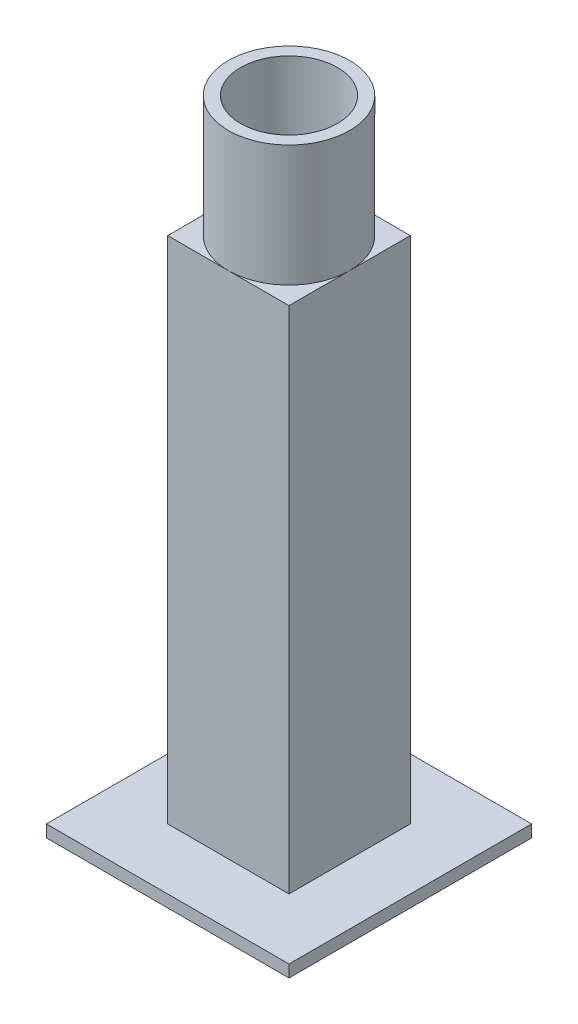
ISO-10303-21;
HEADER;
FILE_DESCRIPTION(('STEP AP214'),'2;1');
FILE_NAME('part.step','',(''),(''),'','','');
FILE_SCHEMA(('AUTOMOTIVE_DESIGN { 1 0 10303 214 1 1 1 1 }'));
ENDSEC;
DATA;
#1=APPLICATION_CONTEXT('core data for automotive mechanical design processes');
#2=APPLICATION_PROTOCOL_DEFINITION('international standard','automotive_design',2000,#1);
#3=PRODUCT_CONTEXT('',#1,'mechanical');
#4=PRODUCT('Part','Part','',(#3));
#5=PRODUCT_RELATED_PRODUCT_CATEGORY('part','',(#4));
#6=PRODUCT_DEFINITION_FORMATION('','',#4);
#7=PRODUCT_DEFINITION_CONTEXT('part definition',#1,'design');
#8=PRODUCT_DEFINITION('design','',#6,#7);
#9=PRODUCT_DEFINITION_SHAPE('','',#8);
#10=(LENGTH_UNIT() NAMED_UNIT(*) SI_UNIT(.MILLI.,.METRE.));
#11=(NAMED_UNIT(*) PLANE_ANGLE_UNIT() SI_UNIT($,.RADIAN.));
#12=(NAMED_UNIT(*) SI_UNIT($,.STERADIAN.) SOLID_ANGLE_UNIT());
#13=UNCERTAINTY_MEASURE_WITH_UNIT(LENGTH_MEASURE(1.E-05),#10,'distance_accuracy_value','');
#14=(GEOMETRIC_REPRESENTATION_CONTEXT(3) GLOBAL_UNCERTAINTY_ASSIGNED_CONTEXT((#13)) GLOBAL_UNIT_ASSIGNED_CONTEXT((#10,
#11,#12)) REPRESENTATION_CONTEXT('',''));
#15=CARTESIAN_POINT('',(0.,0.,0.));
#16=DIRECTION('',(0.,0.,1.));
#17=DIRECTION('',(1.,0.,0.));
#18=AXIS2_PLACEMENT_3D('',#15,#16,#17);
#19=CARTESIAN_POINT('',(0.,430.,0.));
#20=DIRECTION('',(0.,1.,0.));
#21=DIRECTION('',(0.,0.,1.));
#22=AXIS2_PLACEMENT_3D('',#19,#20,#21);
#23=PLANE('',#22);
#24=CARTESIAN_POINT('',(100.,430.,-100.));
#25=DIRECTION('',(0.,1.,0.));
#26=DIRECTION('',(0.,0.,1.));
#27=AXIS2_PLACEMENT_3D('',#24,#25,#26);
#28=CIRCLE('',#27,50.);
#29=CARTESIAN_POINT('',(100.,430.,-50.));
#30=VERTEX_POINT('',#29);
#31=CARTESIAN_POINT('',(150.,430.,-100.));
#32=VERTEX_POINT('',#31);
#33=EDGE_CURVE('E51',#30,#32,#28,.T.);
#34=ORIENTED_EDGE('',*,*,#33,.F.);
#35=DIRECTION('',(1.,0.,0.));
#36=VECTOR('',#35,1.);
#37=CARTESIAN_POINT('',(50.,430.,-50.));
#38=LINE('',#37,#36);
#39=CARTESIAN_POINT('',(150.,430.,-50.));
#40=VERTEX_POINT('',#39);
#41=EDGE_CURVE('E130',#30,#40,#38,.T.);
#42=ORIENTED_EDGE('',*,*,#41,.T.);
#43=DIRECTION('',(0.,0.,-1.));
#44=VECTOR('',#43,1.);
#45=CARTESIAN_POINT('',(150.,430.,-150.));
#46=LINE('',#45,#44);
#47=EDGE_CURVE('E144',#40,#32,#46,.T.);
#48=ORIENTED_EDGE('',*,*,#47,.T.);
#49=EDGE_LOOP('',(#34,#42,#48));
#50=FACE_BOUND('',#49,.T.);
#51=ADVANCED_FACE('F39',(#50),#23,.T.);
#52=CARTESIAN_POINT('',(100.,430.,-150.));
#53=VERTEX_POINT('',#52);
#54=EDGE_CURVE('E11',#32,#53,#28,.T.);
#55=ORIENTED_EDGE('',*,*,#54,.F.);
#56=CARTESIAN_POINT('',(150.,430.,-150.));
#57=VERTEX_POINT('',#56);
#58=EDGE_CURVE('E129',#32,#57,#46,.T.);
#59=ORIENTED_EDGE('',*,*,#58,.T.);
#60=DIRECTION('',(-1.,0.,0.));
#61=VECTOR('',#60,1.);
#62=CARTESIAN_POINT('',(50.,430.,-150.));
#63=LINE('',#62,#61);
#64=EDGE_CURVE('E168',#57,#53,#63,.T.);
#65=ORIENTED_EDGE('',*,*,#64,.T.);
#66=EDGE_LOOP('',(#55,#59,#65));
#67=FACE_BOUND('',#66,.T.);
#68=ADVANCED_FACE('F262',(#67),#23,.T.);
#69=CARTESIAN_POINT('',(50.,430.,-100.));
#70=VERTEX_POINT('',#69);
#71=EDGE_CURVE('E49',#53,#70,#28,.T.);
#72=ORIENTED_EDGE('',*,*,#71,.F.);
#73=CARTESIAN_POINT('',(50.,430.,-150.));
#74=VERTEX_POINT('',#73);
#75=EDGE_CURVE('E167',#53,#74,#63,.T.);
#76=ORIENTED_EDGE('',*,*,#75,.T.);
#77=DIRECTION('',(0.,0.,1.));
#78=VECTOR('',#77,1.);
#79=CARTESIAN_POINT('',(50.,430.,-150.));
#80=LINE('',#79,#78);
#81=EDGE_CURVE('E142',#74,#70,#80,.T.);
#82=ORIENTED_EDGE('',*,*,#81,.T.);
#83=EDGE_LOOP('',(#72,#76,#82));
#84=FACE_BOUND('',#83,.T.);
#85=ADVANCED_FACE('F267',(#84),#23,.T.);
#86=CARTESIAN_POINT('',(0.,10.,0.));
#87=DIRECTION('',(0.,-1.,0.));
#88=DIRECTION('',(0.,0.,-1.));
#89=AXIS2_PLACEMENT_3D('',#86,#87,#88);
#90=PLANE('',#89);
#91=DIRECTION('',(0.,0.,1.));
#92=VECTOR('',#91,1.);
#93=CARTESIAN_POINT('',(0.,10.,0.));
#94=LINE('',#93,#92);
#95=CARTESIAN_POINT('',(0.,10.,-200.));
#96=VERTEX_POINT('',#95);
#97=CARTESIAN_POINT('',(0.,10.,0.));
#98=VERTEX_POINT('',#97);
#99=EDGE_CURVE('E199',#96,#98,#94,.T.);
#100=ORIENTED_EDGE('',*,*,#99,.T.);
#101=DIRECTION('',(1.,0.,0.));
#102=VECTOR('',#101,1.);
#103=CARTESIAN_POINT('',(0.,10.,0.));
#104=LINE('',#103,#102);
#105=CARTESIAN_POINT('',(200.,10.,0.));
#106=VERTEX_POINT('',#105);
#107=EDGE_CURVE('E203',#98,#106,#104,.T.);
#108=ORIENTED_EDGE('',*,*,#107,.T.);
#109=DIRECTION('',(0.,0.,-1.));
#110=VECTOR('',#109,1.);
#111=CARTESIAN_POINT('',(200.,10.,0.));
#112=LINE('',#111,#110);
#113=CARTESIAN_POINT('',(200.,10.,-200.));
#114=VERTEX_POINT('',#113);
#115=EDGE_CURVE('E207',#106,#114,#112,.T.);
#116=ORIENTED_EDGE('',*,*,#115,.T.);
#117=DIRECTION('',(-1.,0.,0.));
#118=VECTOR('',#117,1.);
#119=CARTESIAN_POINT('',(0.,10.,-200.));
#120=LINE('',#119,#118);
#121=EDGE_CURVE('E210',#114,#96,#120,.T.);
#122=ORIENTED_EDGE('',*,*,#121,.T.);
#123=EDGE_LOOP('',(#100,#108,#116,#122));
#124=FACE_BOUND('',#123,.T.);
#125=DIRECTION('',(0.,0.,1.));
#126=VECTOR('',#125,1.);
#127=CARTESIAN_POINT('',(50.,10.,-150.));
#128=LINE('',#127,#126);
#129=CARTESIAN_POINT('',(50.,10.,-150.));
#130=VERTEX_POINT('',#129);
#131=CARTESIAN_POINT('',(50.,10.,-50.));
#132=VERTEX_POINT('',#131);
#133=EDGE_CURVE('E162',#130,#132,#128,.T.);
#134=ORIENTED_EDGE('',*,*,#133,.F.);
#135=DIRECTION('',(-1.,0.,0.));
#136=VECTOR('',#135,1.);
#137=CARTESIAN_POINT('',(50.,10.,-150.));
#138=LINE('',#137,#136);
#139=CARTESIAN_POINT('',(150.,10.,-150.));
#140=VERTEX_POINT('',#139);
#141=EDGE_CURVE('E182',#140,#130,#138,.T.);
#142=ORIENTED_EDGE('',*,*,#141,.F.);
#143=DIRECTION('',(0.,0.,-1.));
#144=VECTOR('',#143,1.);
#145=CARTESIAN_POINT('',(150.,10.,-150.));
#146=LINE('',#145,#144);
#147=CARTESIAN_POINT('',(150.,10.,-50.));
#148=VERTEX_POINT('',#147);
#149=EDGE_CURVE('E178',#148,#140,#146,.T.);
#150=ORIENTED_EDGE('',*,*,#149,.F.);
#151=DIRECTION('',(1.,0.,0.));
#152=VECTOR('',#151,1.);
#153=CARTESIAN_POINT('',(50.,10.,-50.));
#154=LINE('',#153,#152);
#155=EDGE_CURVE('E175',#132,#148,#154,.T.);
#156=ORIENTED_EDGE('',*,*,#155,.F.);
#157=EDGE_LOOP('',(#134,#142,#150,#156));
#158=FACE_BOUND('',#157,.T.);
#159=ADVANCED_FACE('F252',(#124,#158),#90,.F.);
#160=CARTESIAN_POINT('',(0.,10.,0.));
#161=DIRECTION('',(1.,0.,0.));
#162=DIRECTION('',(0.,0.,-1.));
#163=AXIS2_PLACEMENT_3D('',#160,#161,#162);
#164=PLANE('',#163);
#165=DIRECTION('',(0.,0.,1.));
#166=VECTOR('',#165,1.);
#167=CARTESIAN_POINT('',(0.,0.,0.));
#168=LINE('',#167,#166);
#169=CARTESIAN_POINT('',(0.,0.,-200.));
#170=VERTEX_POINT('',#169);
#171=CARTESIAN_POINT('',(0.,0.,0.));
#172=VERTEX_POINT('',#171);
#173=EDGE_CURVE('E198',#170,#172,#168,.T.);
#174=ORIENTED_EDGE('',*,*,#173,.T.);
#175=DIRECTION('',(0.,-1.,0.));
#176=VECTOR('',#175,1.);
#177=CARTESIAN_POINT('',(0.,10.,0.));
#178=LINE('',#177,#176);
#179=EDGE_CURVE('E43',#98,#172,#178,.T.);
#180=ORIENTED_EDGE('',*,*,#179,.F.);
#181=ORIENTED_EDGE('',*,*,#99,.F.);
#182=DIRECTION('',(0.,-1.,0.));
#183=VECTOR('',#182,1.);
#184=CARTESIAN_POINT('',(0.,10.,-200.));
#185=LINE('',#184,#183);
#186=EDGE_CURVE('E213',#96,#170,#185,.T.);
#187=ORIENTED_EDGE('',*,*,#186,.T.);
#188=EDGE_LOOP('',(#174,#180,#181,#187));
#189=FACE_BOUND('',#188,.T.);
#190=ADVANCED_FACE('F41',(#189),#164,.F.);
#191=CARTESIAN_POINT('',(0.,10.,0.));
#192=DIRECTION('',(0.,0.,-1.));
#193=DIRECTION('',(-1.,0.,0.));
#194=AXIS2_PLACEMENT_3D('',#191,#192,#193);
#195=PLANE('',#194);
#196=DIRECTION('',(1.,0.,0.));
#197=VECTOR('',#196,1.);
#198=CARTESIAN_POINT('',(0.,0.,0.));
#199=LINE('',#198,#197);
#200=CARTESIAN_POINT('',(200.,0.,0.));
#201=VERTEX_POINT('',#200);
#202=EDGE_CURVE('E217',#172,#201,#199,.T.);
#203=ORIENTED_EDGE('',*,*,#202,.T.);
#204=DIRECTION('',(0.,-1.,0.));
#205=VECTOR('',#204,1.);
#206=CARTESIAN_POINT('',(200.,10.,0.));
#207=LINE('',#206,#205);
#208=EDGE_CURVE('E154',#106,#201,#207,.T.);
#209=ORIENTED_EDGE('',*,*,#208,.F.);
#210=ORIENTED_EDGE('',*,*,#107,.F.);
#211=ORIENTED_EDGE('',*,*,#179,.T.);
#212=EDGE_LOOP('',(#203,#209,#210,#211));
#213=FACE_BOUND('',#212,.T.);
#214=ADVANCED_FACE('F254',(#213),#195,.F.);
#215=CARTESIAN_POINT('',(200.,10.,0.));
#216=DIRECTION('',(-1.,0.,0.));
#217=DIRECTION('',(0.,0.,1.));
#218=AXIS2_PLACEMENT_3D('',#215,#216,#217);
#219=PLANE('',#218);
#220=DIRECTION('',(0.,0.,-1.));
#221=VECTOR('',#220,1.);
#222=CARTESIAN_POINT('',(200.,0.,0.));
#223=LINE('',#222,#221);
#224=CARTESIAN_POINT('',(200.,0.,-200.));
#225=VERTEX_POINT('',#224);
#226=EDGE_CURVE('E220',#201,#225,#223,.T.);
#227=ORIENTED_EDGE('',*,*,#226,.T.);
#228=DIRECTION('',(0.,-1.,0.));
#229=VECTOR('',#228,1.);
#230=CARTESIAN_POINT('',(200.,10.,-200.));
#231=LINE('',#230,#229);
#232=EDGE_CURVE('E228',#114,#225,#231,.T.);
#233=ORIENTED_EDGE('',*,*,#232,.F.);
#234=ORIENTED_EDGE('',*,*,#115,.F.);
#235=ORIENTED_EDGE('',*,*,#208,.T.);
#236=EDGE_LOOP('',(#227,#233,#234,#235));
#237=FACE_BOUND('',#236,.T.);
#238=ADVANCED_FACE('F237',(#237),#219,.F.);
#239=CARTESIAN_POINT('',(0.,10.,-200.));
#240=DIRECTION('',(0.,0.,1.));
#241=DIRECTION('',(1.,0.,0.));
#242=AXIS2_PLACEMENT_3D('',#239,#240,#241);
#243=PLANE('',#242);
#244=DIRECTION('',(-1.,0.,0.));
#245=VECTOR('',#244,1.);
#246=CARTESIAN_POINT('',(0.,0.,-200.));
#247=LINE('',#246,#245);
#248=EDGE_CURVE('E204',#225,#170,#247,.T.);
#249=ORIENTED_EDGE('',*,*,#248,.T.);
#250=ORIENTED_EDGE('',*,*,#186,.F.);
#251=ORIENTED_EDGE('',*,*,#121,.F.);
#252=ORIENTED_EDGE('',*,*,#232,.T.);
#253=EDGE_LOOP('',(#249,#250,#251,#252));
#254=FACE_BOUND('',#253,.T.);
#255=ADVANCED_FACE('F246',(#254),#243,.F.);
#256=CARTESIAN_POINT('',(0.,0.,0.));
#257=DIRECTION('',(0.,-1.,0.));
#258=DIRECTION('',(0.,0.,-1.));
#259=AXIS2_PLACEMENT_3D('',#256,#257,#258);
#260=PLANE('',#259);
#261=ORIENTED_EDGE('',*,*,#173,.F.);
#262=ORIENTED_EDGE('',*,*,#248,.F.);
#263=ORIENTED_EDGE('',*,*,#226,.F.);
#264=ORIENTED_EDGE('',*,*,#202,.F.);
#265=EDGE_LOOP('',(#261,#262,#263,#264));
#266=FACE_BOUND('',#265,.T.);
#267=ADVANCED_FACE('F243',(#266),#260,.T.);
#268=CARTESIAN_POINT('',(50.,430.,-150.));
#269=DIRECTION('',(1.,0.,0.));
#270=DIRECTION('',(0.,0.,-1.));
#271=AXIS2_PLACEMENT_3D('',#268,#269,#270);
#272=PLANE('',#271);
#273=ORIENTED_EDGE('',*,*,#133,.T.);
#274=DIRECTION('',(0.,-1.,0.));
#275=VECTOR('',#274,1.);
#276=CARTESIAN_POINT('',(50.,430.,-50.));
#277=LINE('',#276,#275);
#278=CARTESIAN_POINT('',(50.,430.,-50.));
#279=VERTEX_POINT('',#278);
#280=EDGE_CURVE('E195',#279,#132,#277,.T.);
#281=ORIENTED_EDGE('',*,*,#280,.F.);
#282=EDGE_CURVE('E124',#70,#279,#80,.T.);
#283=ORIENTED_EDGE('',*,*,#282,.F.);
#284=ORIENTED_EDGE('',*,*,#81,.F.);
#285=DIRECTION('',(0.,-1.,0.));
#286=VECTOR('',#285,1.);
#287=CARTESIAN_POINT('',(50.,430.,-150.));
#288=LINE('',#287,#286);
#289=EDGE_CURVE('E171',#74,#130,#288,.T.);
#290=ORIENTED_EDGE('',*,*,#289,.T.);
#291=EDGE_LOOP('',(#273,#281,#283,#284,#290));
#292=FACE_BOUND('',#291,.T.);
#293=ADVANCED_FACE('F290',(#292),#272,.F.);
#294=CARTESIAN_POINT('',(50.,430.,-50.));
#295=DIRECTION('',(0.,0.,-1.));
#296=DIRECTION('',(-1.,0.,0.));
#297=AXIS2_PLACEMENT_3D('',#294,#295,#296);
#298=PLANE('',#297);
#299=ORIENTED_EDGE('',*,*,#155,.T.);
#300=DIRECTION('',(0.,-1.,0.));
#301=VECTOR('',#300,1.);
#302=CARTESIAN_POINT('',(150.,430.,-50.));
#303=LINE('',#302,#301);
#304=EDGE_CURVE('E137',#40,#148,#303,.T.);
#305=ORIENTED_EDGE('',*,*,#304,.F.);
#306=ORIENTED_EDGE('',*,*,#41,.F.);
#307=EDGE_CURVE('E118',#279,#30,#38,.T.);
#308=ORIENTED_EDGE('',*,*,#307,.F.);
#309=ORIENTED_EDGE('',*,*,#280,.T.);
#310=EDGE_LOOP('',(#299,#305,#306,#308,#309));
#311=FACE_BOUND('',#310,.T.);
#312=ADVANCED_FACE('F135',(#311),#298,.F.);
#313=CARTESIAN_POINT('',(150.,430.,-150.));
#314=DIRECTION('',(-1.,0.,0.));
#315=DIRECTION('',(0.,0.,1.));
#316=AXIS2_PLACEMENT_3D('',#313,#314,#315);
#317=PLANE('',#316);
#318=ORIENTED_EDGE('',*,*,#149,.T.);
#319=DIRECTION('',(0.,-1.,0.));
#320=VECTOR('',#319,1.);
#321=CARTESIAN_POINT('',(150.,430.,-150.));
#322=LINE('',#321,#320);
#323=EDGE_CURVE('E189',#57,#140,#322,.T.);
#324=ORIENTED_EDGE('',*,*,#323,.F.);
#325=ORIENTED_EDGE('',*,*,#58,.F.);
#326=ORIENTED_EDGE('',*,*,#47,.F.);
#327=ORIENTED_EDGE('',*,*,#304,.T.);
#328=EDGE_LOOP('',(#318,#324,#325,#326,#327));
#329=FACE_BOUND('',#328,.T.);
#330=ADVANCED_FACE('F279',(#329),#317,.F.);
#331=CARTESIAN_POINT('',(50.,430.,-150.));
#332=DIRECTION('',(0.,0.,1.));
#333=DIRECTION('',(1.,0.,0.));
#334=AXIS2_PLACEMENT_3D('',#331,#332,#333);
#335=PLANE('',#334);
#336=ORIENTED_EDGE('',*,*,#141,.T.);
#337=ORIENTED_EDGE('',*,*,#289,.F.);
#338=ORIENTED_EDGE('',*,*,#75,.F.);
#339=ORIENTED_EDGE('',*,*,#64,.F.);
#340=ORIENTED_EDGE('',*,*,#323,.T.);
#341=EDGE_LOOP('',(#336,#337,#338,#339,#340));
#342=FACE_BOUND('',#341,.T.);
#343=ADVANCED_FACE('F272',(#342),#335,.F.);
#344=EDGE_CURVE('E122',#70,#30,#28,.T.);
#345=ORIENTED_EDGE('',*,*,#344,.F.);
#346=ORIENTED_EDGE('',*,*,#282,.T.);
#347=ORIENTED_EDGE('',*,*,#307,.T.);
#348=EDGE_LOOP('',(#345,#346,#347));
#349=FACE_BOUND('',#348,.T.);
#350=ADVANCED_FACE('F120',(#349),#23,.T.);
#351=CARTESIAN_POINT('',(100.,530.,-100.));
#352=DIRECTION('',(0.,1.,0.));
#353=DIRECTION('',(0.,0.,1.));
#354=AXIS2_PLACEMENT_3D('',#351,#352,#353);
#355=PLANE('',#354);
#356=CARTESIAN_POINT('',(100.,530.,-100.));
#357=DIRECTION('',(0.,1.,0.));
#358=DIRECTION('',(0.,0.,1.));
#359=AXIS2_PLACEMENT_3D('',#356,#357,#358);
#360=CIRCLE('',#359,50.);
#361=CARTESIAN_POINT('',(100.,530.,-50.));
#362=VERTEX_POINT('',#361);
#363=EDGE_CURVE('E147',#362,#362,#360,.T.);
#364=ORIENTED_EDGE('',*,*,#363,.T.);
#365=EDGE_LOOP('',(#364));
#366=FACE_BOUND('',#365,.T.);
#367=CARTESIAN_POINT('',(100.,530.,-100.));
#368=DIRECTION('',(0.,1.,0.));
#369=DIRECTION('',(0.,0.,1.));
#370=AXIS2_PLACEMENT_3D('',#367,#368,#369);
#371=CIRCLE('',#370,40.);
#372=CARTESIAN_POINT('',(100.,530.,-60.));
#373=VERTEX_POINT('',#372);
#374=EDGE_CURVE('E148',#373,#373,#371,.T.);
#375=ORIENTED_EDGE('',*,*,#374,.F.);
#376=EDGE_LOOP('',(#375));
#377=FACE_BOUND('',#376,.T.);
#378=ADVANCED_FACE('F271',(#366,#377),#355,.T.);
#379=CARTESIAN_POINT('',(100.,530.,-100.));
#380=DIRECTION('',(0.,-1.,0.));
#381=DIRECTION('',(0.,0.,-1.));
#382=AXIS2_PLACEMENT_3D('',#379,#380,#381);
#383=CYLINDRICAL_SURFACE('',#382,50.);
#384=ORIENTED_EDGE('',*,*,#363,.F.);
#385=EDGE_LOOP('',(#384));
#386=FACE_BOUND('',#385,.T.);
#387=ORIENTED_EDGE('',*,*,#33,.T.);
#388=ORIENTED_EDGE('',*,*,#54,.T.);
#389=ORIENTED_EDGE('',*,*,#71,.T.);
#390=ORIENTED_EDGE('',*,*,#344,.T.);
#391=EDGE_LOOP('',(#387,#388,#389,#390));
#392=FACE_BOUND('',#391,.T.);
#393=ADVANCED_FACE('F149',(#386,#392),#383,.T.);
#394=CARTESIAN_POINT('',(100.,10.,-100.));
#395=DIRECTION('',(0.,1.,0.));
#396=DIRECTION('',(0.,0.,1.));
#397=AXIS2_PLACEMENT_3D('',#394,#395,#396);
#398=PLANE('',#397);
#399=CARTESIAN_POINT('',(100.,10.,-100.));
#400=DIRECTION('',(0.,1.,0.));
#401=DIRECTION('',(0.,0.,1.));
#402=AXIS2_PLACEMENT_3D('',#399,#400,#401);
#403=CIRCLE('',#402,40.);
#404=CARTESIAN_POINT('',(100.,10.,-60.));
#405=VERTEX_POINT('',#404);
#406=EDGE_CURVE('E158',#405,#405,#403,.T.);
#407=ORIENTED_EDGE('',*,*,#406,.T.);
#408=EDGE_LOOP('',(#407));
#409=FACE_BOUND('',#408,.T.);
#410=ADVANCED_FACE('F346',(#409),#398,.T.);
#411=CARTESIAN_POINT('',(100.,10.,-100.));
#412=DIRECTION('',(0.,1.,0.));
#413=DIRECTION('',(0.,0.,1.));
#414=AXIS2_PLACEMENT_3D('',#411,#412,#413);
#415=CYLINDRICAL_SURFACE('',#414,40.);
#416=ORIENTED_EDGE('',*,*,#406,.F.);
#417=EDGE_LOOP('',(#416));
#418=FACE_BOUND('',#417,.T.);
#419=ORIENTED_EDGE('',*,*,#374,.T.);
#420=EDGE_LOOP('',(#419));
#421=FACE_BOUND('',#420,.T.);
#422=ADVANCED_FACE('F354',(#418,#421),#415,.F.);
#423=CLOSED_SHELL('',(#51,#68,#85,#159,#190,#214,#238,#255,#267,#293,#312,#330,#343,#350,#378,
#393,#410,#422));
#424=MANIFOLD_SOLID_BREP('B2',#423);
#425=ADVANCED_BREP_SHAPE_REPRESENTATION('',(#18,#424),#14);
#426=SHAPE_DEFINITION_REPRESENTATION(#9,#425);
ENDSEC;
END-ISO-10303-21;
